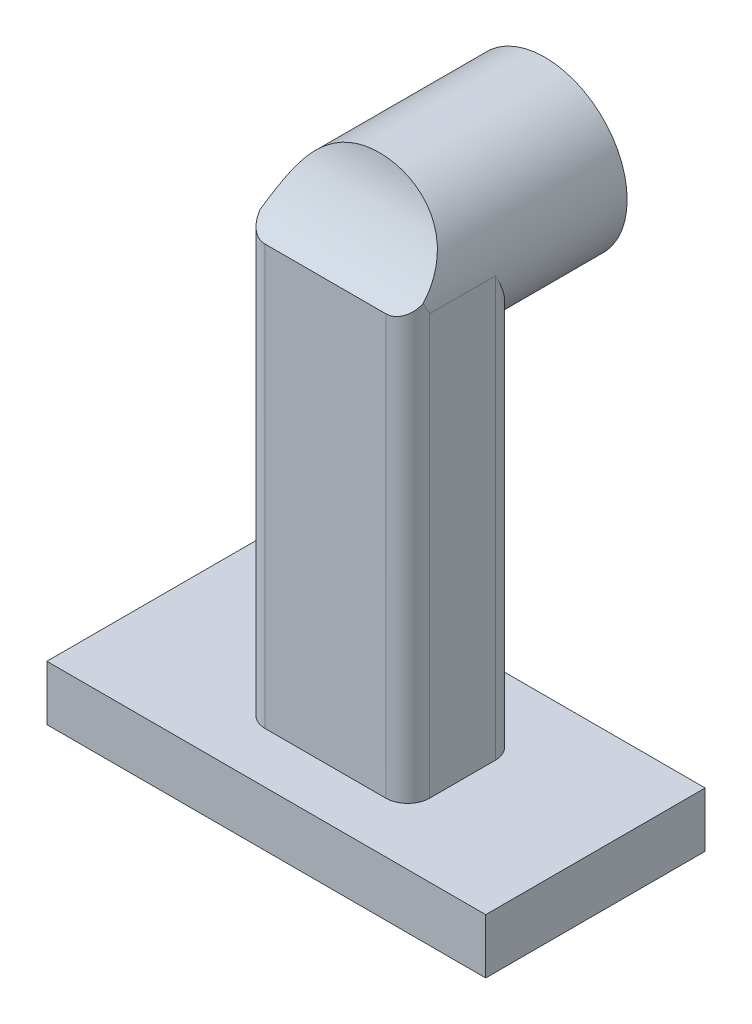
ISO-10303-21;
HEADER;
FILE_DESCRIPTION(('STEP AP214'),'2;1');
FILE_NAME('part.step','',(''),(''),'','','');
FILE_SCHEMA(('AUTOMOTIVE_DESIGN { 1 0 10303 214 1 1 1 1 }'));
ENDSEC;
DATA;
#1=APPLICATION_CONTEXT('core data for automotive mechanical design processes');
#2=APPLICATION_PROTOCOL_DEFINITION('international standard','automotive_design',2000,#1);
#3=PRODUCT_CONTEXT('',#1,'mechanical');
#4=PRODUCT('Part','Part','',(#3));
#5=PRODUCT_RELATED_PRODUCT_CATEGORY('part','',(#4));
#6=PRODUCT_DEFINITION_FORMATION('','',#4);
#7=PRODUCT_DEFINITION_CONTEXT('part definition',#1,'design');
#8=PRODUCT_DEFINITION('design','',#6,#7);
#9=PRODUCT_DEFINITION_SHAPE('','',#8);
#10=(LENGTH_UNIT() NAMED_UNIT(*) SI_UNIT(.MILLI.,.METRE.));
#11=(NAMED_UNIT(*) PLANE_ANGLE_UNIT() SI_UNIT($,.RADIAN.));
#12=(NAMED_UNIT(*) SI_UNIT($,.STERADIAN.) SOLID_ANGLE_UNIT());
#13=UNCERTAINTY_MEASURE_WITH_UNIT(LENGTH_MEASURE(1.E-05),#10,'distance_accuracy_value','');
#14=(GEOMETRIC_REPRESENTATION_CONTEXT(3) GLOBAL_UNCERTAINTY_ASSIGNED_CONTEXT((#13)) GLOBAL_UNIT_ASSIGNED_CONTEXT((#10,
#11,#12)) REPRESENTATION_CONTEXT('',''));
#15=CARTESIAN_POINT('',(0.,0.,0.));
#16=DIRECTION('',(0.,0.,1.));
#17=DIRECTION('',(1.,0.,0.));
#18=AXIS2_PLACEMENT_3D('',#15,#16,#17);
#19=CARTESIAN_POINT('',(0.,31.7142857142858,15.));
#20=DIRECTION('',(0.,0.,-1.));
#21=DIRECTION('',(-1.,0.,0.));
#22=AXIS2_PLACEMENT_3D('',#19,#20,#21);
#23=CYLINDRICAL_SURFACE('',#22,7.5);
#24=DIRECTION('',(0.,0.,1.));
#25=VECTOR('',#24,1.);
#26=CARTESIAN_POINT('',(-7.5,31.7142857142858,10.));
#27=LINE('',#26,#25);
#28=CARTESIAN_POINT('',(-7.5,31.7142857142858,12.));
#29=VERTEX_POINT('',#28);
#30=CARTESIAN_POINT('',(-7.5,31.7142857142858,18.));
#31=VERTEX_POINT('',#30);
#32=EDGE_CURVE('E178',#29,#31,#27,.T.);
#33=ORIENTED_EDGE('',*,*,#32,.T.);
#34=CARTESIAN_POINT('',(-7.42828389927455,32.7489829220614,18.530774155172));
#35=CARTESIAN_POINT('',(-7.45190089264952,32.5793512710142,18.4449269340188));
#36=CARTESIAN_POINT('',(-7.46966271610241,32.4093934973662,18.358046270152));
#37=CARTESIAN_POINT('',(-7.49351926490928,32.0695040462761,18.1834226286113));
#38=CARTESIAN_POINT('',(-7.49963574905937,31.89957291454,18.0956815676288));
#39=CARTESIAN_POINT('',(-7.49999473202665,31.724545468634,18.0052981125601));
#40=CARTESIAN_POINT('',(-7.49999999489412,31.7194155736733,18.0026490461109));
#41=CARTESIAN_POINT('',(-7.5,31.7142857142858,18.));
#42=B_SPLINE_CURVE_WITH_KNOTS('',3,(#34,#35,#36,#37,#38,#39,#40,#41),.UNSPECIFIED.,.F.,.F.,(4,2,
2,4),(0.,0.574711385582151,1.14834789074926,1.16566840602221),.UNSPECIFIED.);
#43=CARTESIAN_POINT('',(-7.42828389927455,32.7489829220614,18.530774155172));
#44=VERTEX_POINT('',#43);
#45=EDGE_CURVE('E224',#31,#44,#42,.F.);
#46=ORIENTED_EDGE('',*,*,#45,.T.);
#47=CARTESIAN_POINT('',(-7.5,31.7142857142858,20.));
#48=CARTESIAN_POINT('',(-7.49997947022665,31.8300297324728,19.799463736408));
#49=CARTESIAN_POINT('',(-7.49731929158803,31.9528236813804,19.6029216316628));
#50=CARTESIAN_POINT('',(-7.48461263215864,32.2117613698325,19.2187715451666));
#51=CARTESIAN_POINT('',(-7.47455767069132,32.3479202814414,19.031174084799));
#52=CARTESIAN_POINT('',(-7.44486452192456,32.6333396918552,18.6653357941587));
#53=CARTESIAN_POINT('',(-7.42517465671868,32.7826672409156,18.4871512264745));
#54=CARTESIAN_POINT('',(-7.37396931885938,33.0923991582677,18.142593196295));
#55=CARTESIAN_POINT('',(-7.34245976664357,33.2527979482482,17.9762138701306));
#56=CARTESIAN_POINT('',(-7.27156816511602,33.5567368043505,17.6818750036999));
#57=CARTESIAN_POINT('',(-7.23423036948041,33.698910121249,17.5520096676919));
#58=CARTESIAN_POINT('',(-7.14846464553897,33.9885442732456,17.3022335173043));
#59=CARTESIAN_POINT('',(-7.1000387962348,34.1360041127588,17.1823208425437));
#60=CARTESIAN_POINT('',(-6.99122197651252,34.4341983888275,16.9534125414698));
#61=CARTESIAN_POINT('',(-6.93086682452595,34.5849218482469,16.8443856701614));
#62=CARTESIAN_POINT('',(-6.79731370783965,34.8882388363534,16.637331889674));
#63=CARTESIAN_POINT('',(-6.72411595473926,35.0408323341906,16.5393047993024));
#64=CARTESIAN_POINT('',(-6.56397643536317,35.3466615217733,16.3540431697069));
#65=CARTESIAN_POINT('',(-6.47696597584459,35.4998964821475,16.266866678474));
#66=CARTESIAN_POINT('',(-6.28932187434638,35.8040730015986,16.1038991718804));
#67=CARTESIAN_POINT('',(-6.18868800528389,35.9550145224006,16.0281083463471));
#68=CARTESIAN_POINT('',(-5.97391094832465,36.2525765961502,15.8875620783022));
#69=CARTESIAN_POINT('',(-5.85975638935033,36.3991933806492,15.8228160378698));
#70=CARTESIAN_POINT('',(-5.61853413824167,36.6859222830463,15.703861081419));
#71=CARTESIAN_POINT('',(-5.49146692780388,36.8260346433029,15.6496517725556));
#72=CARTESIAN_POINT('',(-5.23452245496772,37.0883999673142,15.5543984099222));
#73=CARTESIAN_POINT('',(-5.10546140165159,37.2112168016263,15.5126992615376));
#74=CARTESIAN_POINT('',(-4.83765037908191,37.4483175471951,15.4369086217491));
#75=CARTESIAN_POINT('',(-4.6989009008013,37.5626018902399,15.4028167452042));
#76=CARTESIAN_POINT('',(-4.41256553042484,37.7815551083798,15.3413578320313));
#77=CARTESIAN_POINT('',(-4.26497771460997,37.886221877494,15.3139922660912));
#78=CARTESIAN_POINT('',(-3.96193609881429,38.0849923789193,15.2650910800854));
#79=CARTESIAN_POINT('',(-3.80648202088287,38.1790957375986,15.2435556661962));
#80=CARTESIAN_POINT('',(-3.48063432880283,38.3604642081219,15.2044631904618));
#81=CARTESIAN_POINT('',(-3.30988281939107,38.4471418150068,15.187162779071));
#82=CARTESIAN_POINT('',(-2.96191709415959,38.6073066805713,15.1570568569415));
#83=CARTESIAN_POINT('',(-2.78470249654392,38.680793158484,15.1442516122236));
#84=CARTESIAN_POINT('',(-2.42510319643625,38.8139762165239,15.1222878301859));
#85=CARTESIAN_POINT('',(-2.24272262146909,38.8736834754834,15.1131264648651));
#86=CARTESIAN_POINT('',(-1.87386192936245,38.9789557438518,15.097719089321));
#87=CARTESIAN_POINT('',(-1.68738267985585,39.0245237160582,15.0914724681932));
#88=CARTESIAN_POINT('',(-1.25295397163505,39.1131592107462,15.0797410124886));
#89=CARTESIAN_POINT('',(-1.00390855808538,39.1510503055967,15.0750959783665));
#90=CARTESIAN_POINT('',(-0.50323218156738,39.2016132826796,15.0689932956617));
#91=CARTESIAN_POINT('',(-0.251601134470506,39.2142843417013,15.0675357511222));
#92=CARTESIAN_POINT('',(0.20665092681727,39.214286841649,15.0675390048493));
#93=CARTESIAN_POINT('',(0.413281674428667,39.2057409358025,15.0685249440406));
#94=CARTESIAN_POINT('',(0.825179286914942,39.1716168798197,15.0725995530894));
#95=CARTESIAN_POINT('',(1.03044576522508,39.1460340940707,15.0756887952457));
#96=CARTESIAN_POINT('',(1.43837174912811,39.0779737983363,15.0843511909973));
#97=CARTESIAN_POINT('',(1.64102762473084,39.0354749375616,15.0899274847249));
#98=CARTESIAN_POINT('',(2.04202119975711,38.9339063500573,15.1041825371708));
#99=CARTESIAN_POINT('',(2.24035919214448,38.8748377513666,15.1128610847041));
#100=CARTESIAN_POINT('',(2.63147873882464,38.7405301869507,15.134168206578));
#101=CARTESIAN_POINT('',(2.82425488916164,38.6652760579644,15.1468004900256));
#102=CARTESIAN_POINT('',(3.20261935265094,38.4992622777185,15.177044788796));
#103=CARTESIAN_POINT('',(3.38820750085756,38.4085022708981,15.1946569183163));
#104=CARTESIAN_POINT('',(3.75066396371892,38.212359111719,15.2360350926952));
#105=CARTESIAN_POINT('',(3.92753645458062,38.1069830569881,15.2597981554513));
#106=CARTESIAN_POINT('',(4.27123126739658,37.8826475562933,15.3147637218743));
#107=CARTESIAN_POINT('',(4.43805404674669,37.7636887292412,15.3459658866419));
#108=CARTESIAN_POINT('',(4.75540880578962,37.5173203715082,15.4160450807998));
#109=CARTESIAN_POINT('',(4.90628078424046,37.3902749644493,15.4546616166388));
#110=CARTESIAN_POINT('',(5.1961273407495,37.1261885124987,15.5412730956522));
#111=CARTESIAN_POINT('',(5.33510218752381,36.9891476934991,15.5892678269246));
#112=CARTESIAN_POINT('',(5.60006908907717,36.70694676478,15.6956205794986));
#113=CARTESIAN_POINT('',(5.72606905660451,36.5617916878983,15.7539722247655));
#114=CARTESIAN_POINT('',(5.9644079229706,36.2653300539792,15.8818619836834));
#115=CARTESIAN_POINT('',(6.07674776889822,36.1140239243806,15.951399321026));
#116=CARTESIAN_POINT('',(6.27942607903662,35.8189675000772,16.0965324462162));
#117=CARTESIAN_POINT('',(6.37078200965697,35.6754994913075,16.1712850172543));
#118=CARTESIAN_POINT('',(6.54133249068087,35.3870289145572,16.3309800487646));
#119=CARTESIAN_POINT('',(6.62052770940052,35.2420264313751,16.4159219488046));
#120=CARTESIAN_POINT('',(6.76694922788573,34.9523015145867,16.595928665728));
#121=CARTESIAN_POINT('',(6.83417683501177,34.807579052101,16.6909923750738));
#122=CARTESIAN_POINT('',(6.95714605734311,34.5200950947532,16.8909840026296));
#123=CARTESIAN_POINT('',(7.01288744385311,34.3773336389884,16.9959121171834));
#124=CARTESIAN_POINT('',(7.1137881303945,34.0947522002077,17.2156292164316));
#125=CARTESIAN_POINT('',(7.15890470810607,33.9549460831521,17.3304555581534));
#126=CARTESIAN_POINT('',(7.23917471989298,33.6802045716417,17.5690520614072));
#127=CARTESIAN_POINT('',(7.27432777219934,33.5452693639967,17.6928225654216));
#128=CARTESIAN_POINT('',(7.33572642516498,33.281289169851,17.9487858169241));
#129=CARTESIAN_POINT('',(7.36196456788971,33.1522491928342,18.0809855067521));
#130=CARTESIAN_POINT('',(7.40660469378779,32.9010816473765,18.3530655320413));
#131=CARTESIAN_POINT('',(7.425004820841,32.7789557221823,18.4929476779407));
#132=CARTESIAN_POINT('',(7.46246035599878,32.4844958116708,18.8498990624335));
#133=CARTESIAN_POINT('',(7.47743876178564,32.3168032891735,19.0712723565462));
#134=CARTESIAN_POINT('',(7.49150705474002,32.0797459598552,19.4129104775812));
#135=CARTESIAN_POINT('',(7.49479812937745,32.003260923985,19.5281775022434));
#136=CARTESIAN_POINT('',(7.49904270891795,31.8551208326223,19.7618117788647));
#137=CARTESIAN_POINT('',(7.49999630305651,31.7834655928494,19.8801789122998));
#138=CARTESIAN_POINT('',(7.5,31.7142857142858,20.));
#139=B_SPLINE_CURVE_WITH_KNOTS('',3,(#47,#48,#49,#50,#51,#52,#53,#54,#55,#56,#57,#58,#59,#60,
#61,#62,#63,#64,#65,#66,#67,#68,#69,#70,#71,#72,#73,#74,#75,#76,#77,#78,#79,#80,#81,#82,#83,#84,
#85,#86,#87,#88,#89,#90,#91,#92,#93,#94,#95,#96,#97,#98,#99,#100,#101,#102,#103,#104,#105,#106,
#107,#108,#109,#110,#111,#112,#113,#114,#115,#116,#117,#118,#119,#120,#121,#122,#123,#124,#125,
#126,#127,#128,#129,#130,#131,#132,#133,#134,#135,#136,#137,#138),.UNSPECIFIED.,.F.,.F.,(4,2,2,
2,2,2,2,2,2,2,2,2,2,2,2,2,2,2,2,2,2,2,2,2,2,2,2,2,2,2,2,2,2,2,2,2,2,2,2,2,2,2,2,2,2,4),(0.,
0.694570167890533,1.38993814537298,2.08907738071809,2.78786688641169,3.37570773489505,
3.96343845379065,4.54943057462419,5.13541304134706,5.72440668533054,6.31341014820949,
6.90291253588654,7.49239294069636,8.04069919501781,8.58897768337745,9.13737594477243,
9.68579359710709,10.2619796544099,10.8381998042333,11.4139718750697,11.9896232149333,
12.7441416974492,13.4986848079011,14.118423798453,14.7383314844778,15.3590240867678,
15.979674443638,16.6009088035043,17.2221574106248,17.8431053856024,18.4640250777839,
19.0661764324764,19.6683141830088,20.2700825167167,20.8718091045698,21.4284907103058,
21.985141711539,22.5417318659863,23.0983331012988,23.657135606618,24.2159595204866,
24.7752497844986,25.3346724204842,26.1675745746305,26.5825847885888,26.997579158897),.UNSPECIFIED.);
#140=CARTESIAN_POINT('',(7.42828389927427,32.7489829220633,18.5307741551697));
#141=VERTEX_POINT('',#140);
#142=EDGE_CURVE('E193',#44,#141,#139,.T.);
#143=ORIENTED_EDGE('',*,*,#142,.T.);
#144=CARTESIAN_POINT('',(7.42828389927427,32.7489829220633,18.5307741551697));
#145=CARTESIAN_POINT('',(7.45190089264941,32.579351271015,18.4449269340185));
#146=CARTESIAN_POINT('',(7.46966271610237,32.4093934973666,18.3580462701521));
#147=CARTESIAN_POINT('',(7.49351926490928,32.0695040462763,18.1834226286115));
#148=CARTESIAN_POINT('',(7.49963574905935,31.8995729145403,18.0956815676285));
#149=CARTESIAN_POINT('',(7.49999473202665,31.724545468634,18.0052981125601));
#150=CARTESIAN_POINT('',(7.49999999489412,31.7194155736733,18.0026490461109));
#151=CARTESIAN_POINT('',(7.5,31.7142857142858,18.));
#152=B_SPLINE_CURVE_WITH_KNOTS('',3,(#144,#145,#146,#147,#148,#149,#150,#151),.UNSPECIFIED.,.F.,
.F.,(4,2,2,4),(0.,0.574711385582514,1.14834789074999,1.16566840602293),.UNSPECIFIED.);
#153=CARTESIAN_POINT('',(7.5,31.7142857142858,18.));
#154=VERTEX_POINT('',#153);
#155=EDGE_CURVE('E53',#141,#154,#152,.T.);
#156=ORIENTED_EDGE('',*,*,#155,.T.);
#157=DIRECTION('',(0.,0.,1.));
#158=VECTOR('',#157,1.);
#159=CARTESIAN_POINT('',(7.5,31.7142857142858,10.));
#160=LINE('',#159,#158);
#161=CARTESIAN_POINT('',(7.5,31.7142857142858,12.));
#162=VERTEX_POINT('',#161);
#163=EDGE_CURVE('E182',#162,#154,#160,.T.);
#164=ORIENTED_EDGE('',*,*,#163,.F.);
#165=CARTESIAN_POINT('',(5.5,26.615266200693,10.));
#166=CARTESIAN_POINT('',(5.5838735625346,26.7057073597006,10.0000376984018));
#167=CARTESIAN_POINT('',(5.66540543927748,26.7981531377399,10.0052713271063));
#168=CARTESIAN_POINT('',(5.82325324536424,26.9862116367144,10.0246893030014));
#169=CARTESIAN_POINT('',(5.89957888470958,27.0818179392423,10.0388564529449));
#170=CARTESIAN_POINT('',(6.04618182718063,27.2748847955983,10.074559287519));
#171=CARTESIAN_POINT('',(6.11650495776172,27.3723227311482,10.0960314263168));
#172=CARTESIAN_POINT('',(6.25174389528762,27.5694106340509,10.1452593425902));
#173=CARTESIAN_POINT('',(6.31665611761133,27.6690620132765,10.1730192410298));
#174=CARTESIAN_POINT('',(6.47418036997727,27.9237915083804,10.2500723707414));
#175=CARTESIAN_POINT('',(6.56309720992839,28.0800797586921,10.3029530221486));
#176=CARTESIAN_POINT('',(6.72823007903668,28.3957498426527,10.4183552788745));
#177=CARTESIAN_POINT('',(6.80444189774752,28.5551326823897,10.4808800670981));
#178=CARTESIAN_POINT('',(6.9448606559125,28.8770498232048,10.6137222482944));
#179=CARTESIAN_POINT('',(7.00900155909153,29.0395963806555,10.6840793357416));
#180=CARTESIAN_POINT('',(7.1251258354692,29.3663818139644,10.8305141632412));
#181=CARTESIAN_POINT('',(7.1771108062949,29.530620464469,10.9065911498011));
#182=CARTESIAN_POINT('',(7.26946547693176,29.86106674954,11.0633566213054));
#183=CARTESIAN_POINT('',(7.30978477168666,30.0272797905243,11.1440633642412));
#184=CARTESIAN_POINT('',(7.37879092805543,30.3606101473289,11.3085487363188));
#185=CARTESIAN_POINT('',(7.40747355029198,30.5277277702713,11.3923284728897));
#186=CARTESIAN_POINT('',(7.47621611769091,31.0289634381359,11.6461301959614));
#187=CARTESIAN_POINT('',(7.49929759585052,31.3641496049488,11.8191909256303));
#188=CARTESIAN_POINT('',(7.49999473288974,31.70402603317,11.9947019284023));
#189=CARTESIAN_POINT('',(7.49999999569959,31.7091559287259,11.9973509952173));
#190=CARTESIAN_POINT('',(7.5,31.7142857142858,12.));
#191=B_SPLINE_CURVE_WITH_KNOTS('',3,(#165,#166,#167,#168,#169,#170,#171,#172,#173,#174,#175,
#176,#177,#178,#179,#180,#181,#182,#183,#184,#185,#186,#187,#188,#189,#190),.UNSPECIFIED.,.F.,
.F.,(4,2,2,2,2,2,2,2,2,2,2,2,4),(0.,0.369717687843046,0.738725823760761,1.10460273899726,
1.47072014543853,2.03213982203334,2.59374518493209,3.15833887293874,3.72285831589875,
4.28978170341005,4.85691144274635,5.98712235199295,6.00444286726743),.UNSPECIFIED.);
#192=CARTESIAN_POINT('',(5.5,26.615266200693,10.));
#193=VERTEX_POINT('',#192);
#194=EDGE_CURVE('E11',#162,#193,#191,.F.);
#195=ORIENTED_EDGE('',*,*,#194,.T.);
#196=CARTESIAN_POINT('',(0.,31.7142857142858,10.));
#197=DIRECTION('',(0.,0.,-1.));
#198=DIRECTION('',(-1.,0.,0.));
#199=AXIS2_PLACEMENT_3D('',#196,#197,#198);
#200=CIRCLE('',#199,7.5);
#201=CARTESIAN_POINT('',(-5.5,26.615266200693,10.));
#202=VERTEX_POINT('',#201);
#203=EDGE_CURVE('E190',#193,#202,#200,.T.);
#204=ORIENTED_EDGE('',*,*,#203,.T.);
#205=CARTESIAN_POINT('',(-5.5,26.615266200693,10.));
#206=CARTESIAN_POINT('',(-5.5838735625346,26.7057073597006,10.0000376984018));
#207=CARTESIAN_POINT('',(-5.66540543927748,26.7981531377399,10.0052713271063));
#208=CARTESIAN_POINT('',(-5.82325324536424,26.9862116367144,10.0246893030014));
#209=CARTESIAN_POINT('',(-5.89957888470958,27.0818179392423,10.0388564529449));
#210=CARTESIAN_POINT('',(-6.04618182718063,27.2748847955983,10.074559287519));
#211=CARTESIAN_POINT('',(-6.11650495776172,27.3723227311482,10.0960314263168));
#212=CARTESIAN_POINT('',(-6.25174389528762,27.5694106340509,10.1452593425902));
#213=CARTESIAN_POINT('',(-6.31665611761133,27.6690620132765,10.1730192410298));
#214=CARTESIAN_POINT('',(-6.47418036997727,27.9237915083804,10.2500723707414));
#215=CARTESIAN_POINT('',(-6.56309720992839,28.0800797586921,10.3029530221486));
#216=CARTESIAN_POINT('',(-6.72823007903668,28.3957498426527,10.4183552788745));
#217=CARTESIAN_POINT('',(-6.80444189774752,28.5551326823897,10.4808800670981));
#218=CARTESIAN_POINT('',(-6.9448606559125,28.8770498232048,10.6137222482944));
#219=CARTESIAN_POINT('',(-7.00900155909153,29.0395963806555,10.6840793357416));
#220=CARTESIAN_POINT('',(-7.1251258354692,29.3663818139644,10.8305141632412));
#221=CARTESIAN_POINT('',(-7.1771108062949,29.530620464469,10.9065911498011));
#222=CARTESIAN_POINT('',(-7.26946547693176,29.86106674954,11.0633566213054));
#223=CARTESIAN_POINT('',(-7.30978477168666,30.0272797905243,11.1440633642412));
#224=CARTESIAN_POINT('',(-7.37879092805543,30.3606101473289,11.3085487363188));
#225=CARTESIAN_POINT('',(-7.40747355029198,30.5277277702713,11.3923284728897));
#226=CARTESIAN_POINT('',(-7.47621611769091,31.0289634381359,11.6461301959614));
#227=CARTESIAN_POINT('',(-7.49929759585052,31.3641496049488,11.8191909256303));
#228=CARTESIAN_POINT('',(-7.49999473288974,31.70402603317,11.9947019284023));
#229=CARTESIAN_POINT('',(-7.49999999569959,31.7091559287259,11.9973509952173));
#230=CARTESIAN_POINT('',(-7.5,31.7142857142858,12.));
#231=B_SPLINE_CURVE_WITH_KNOTS('',3,(#205,#206,#207,#208,#209,#210,#211,#212,#213,#214,#215,
#216,#217,#218,#219,#220,#221,#222,#223,#224,#225,#226,#227,#228,#229,#230),.UNSPECIFIED.,.F.,
.F.,(4,2,2,2,2,2,2,2,2,2,2,2,4),(0.,0.369717687843046,0.738725823760761,1.10460273899726,
1.47072014543853,2.03213982203334,2.59374518493209,3.15833887293874,3.72285831589875,
4.28978170341005,4.85691144274635,5.98712235199295,6.00444286726743),.UNSPECIFIED.);
#232=EDGE_CURVE('E46',#202,#29,#231,.T.);
#233=ORIENTED_EDGE('',*,*,#232,.T.);
#234=EDGE_LOOP('',(#33,#46,#143,#156,#164,#195,#204,#233));
#235=FACE_BOUND('',#234,.T.);
#236=CARTESIAN_POINT('',(0.,31.7142857142858,0.));
#237=DIRECTION('',(0.,0.,1.));
#238=DIRECTION('',(1.,0.,0.));
#239=AXIS2_PLACEMENT_3D('',#236,#237,#238);
#240=CIRCLE('',#239,7.5);
#241=CARTESIAN_POINT('',(7.5,31.7142857142858,0.));
#242=VERTEX_POINT('',#241);
#243=EDGE_CURVE('E181',#242,#242,#240,.T.);
#244=ORIENTED_EDGE('',*,*,#243,.T.);
#245=EDGE_LOOP('',(#244));
#246=FACE_BOUND('',#245,.T.);
#247=ADVANCED_FACE('F32',(#235,#246),#23,.T.);
#248=CARTESIAN_POINT('',(0.,31.7142857142858,0.));
#249=DIRECTION('',(0.,0.,1.));
#250=DIRECTION('',(1.,0.,0.));
#251=AXIS2_PLACEMENT_3D('',#248,#249,#250);
#252=PLANE('',#251);
#253=CARTESIAN_POINT('',(0.,31.7142857142858,0.));
#254=DIRECTION('',(0.,0.,-1.));
#255=DIRECTION('',(-1.,0.,0.));
#256=AXIS2_PLACEMENT_3D('',#253,#254,#255);
#257=CIRCLE('',#256,3.5);
#258=CARTESIAN_POINT('',(-3.5,31.7142857142858,0.));
#259=VERTEX_POINT('',#258);
#260=EDGE_CURVE('E158',#259,#259,#257,.T.);
#261=ORIENTED_EDGE('',*,*,#260,.F.);
#262=EDGE_LOOP('',(#261));
#263=FACE_BOUND('',#262,.T.);
#264=ORIENTED_EDGE('',*,*,#243,.F.);
#265=EDGE_LOOP('',(#264));
#266=FACE_BOUND('',#265,.T.);
#267=ADVANCED_FACE('F316',(#263,#266),#252,.F.);
#268=CARTESIAN_POINT('',(-7.5,-6.5223606883933,10.));
#269=DIRECTION('',(-1.,0.,0.));
#270=DIRECTION('',(0.,-1.,0.));
#271=AXIS2_PLACEMENT_3D('',#268,#269,#270);
#272=PLANE('',#271);
#273=ORIENTED_EDGE('',*,*,#32,.F.);
#274=DIRECTION('',(0.,-1.,0.));
#275=VECTOR('',#274,1.);
#276=CARTESIAN_POINT('',(-7.5,-6.5223606883933,12.));
#277=LINE('',#276,#275);
#278=CARTESIAN_POINT('',(-7.5,-6.5223606883933,12.));
#279=VERTEX_POINT('',#278);
#280=EDGE_CURVE('E268',#29,#279,#277,.T.);
#281=ORIENTED_EDGE('',*,*,#280,.T.);
#282=DIRECTION('',(0.,0.,1.));
#283=VECTOR('',#282,1.);
#284=CARTESIAN_POINT('',(-7.5,-6.5223606883933,10.));
#285=LINE('',#284,#283);
#286=CARTESIAN_POINT('',(-7.5,-6.5223606883933,18.));
#287=VERTEX_POINT('',#286);
#288=EDGE_CURVE('E177',#279,#287,#285,.T.);
#289=ORIENTED_EDGE('',*,*,#288,.T.);
#290=DIRECTION('',(0.,-1.,0.));
#291=VECTOR('',#290,1.);
#292=CARTESIAN_POINT('',(-7.5,31.7142857142858,18.));
#293=LINE('',#292,#291);
#294=EDGE_CURVE('E200',#287,#31,#293,.F.);
#295=ORIENTED_EDGE('',*,*,#294,.T.);
#296=EDGE_LOOP('',(#273,#281,#289,#295));
#297=FACE_BOUND('',#296,.T.);
#298=ADVANCED_FACE('F275',(#297),#272,.T.);
#299=CARTESIAN_POINT('',(7.5,31.7142857142858,10.));
#300=DIRECTION('',(1.,0.,0.));
#301=DIRECTION('',(0.,1.,0.));
#302=AXIS2_PLACEMENT_3D('',#299,#300,#301);
#303=PLANE('',#302);
#304=ORIENTED_EDGE('',*,*,#163,.T.);
#305=DIRECTION('',(0.,1.,0.));
#306=VECTOR('',#305,1.);
#307=CARTESIAN_POINT('',(7.5,-6.5223606883933,18.));
#308=LINE('',#307,#306);
#309=CARTESIAN_POINT('',(7.5,-6.5223606883933,18.));
#310=VERTEX_POINT('',#309);
#311=EDGE_CURVE('E285',#154,#310,#308,.F.);
#312=ORIENTED_EDGE('',*,*,#311,.T.);
#313=DIRECTION('',(0.,0.,1.));
#314=VECTOR('',#313,1.);
#315=CARTESIAN_POINT('',(7.5,-6.5223606883933,10.));
#316=LINE('',#315,#314);
#317=CARTESIAN_POINT('',(7.5,-6.5223606883933,12.));
#318=VERTEX_POINT('',#317);
#319=EDGE_CURVE('E184',#318,#310,#316,.T.);
#320=ORIENTED_EDGE('',*,*,#319,.F.);
#321=DIRECTION('',(0.,1.,0.));
#322=VECTOR('',#321,1.);
#323=CARTESIAN_POINT('',(7.5,31.7142857142858,12.));
#324=LINE('',#323,#322);
#325=EDGE_CURVE('E284',#318,#162,#324,.T.);
#326=ORIENTED_EDGE('',*,*,#325,.T.);
#327=EDGE_LOOP('',(#304,#312,#320,#326));
#328=FACE_BOUND('',#327,.T.);
#329=ADVANCED_FACE('F295',(#328),#303,.T.);
#330=CARTESIAN_POINT('',(0.,0.,10.));
#331=DIRECTION('',(0.,0.,-1.));
#332=DIRECTION('',(-1.,0.,0.));
#333=AXIS2_PLACEMENT_3D('',#330,#331,#332);
#334=PLANE('',#333);
#335=DIRECTION('',(1.,0.,0.));
#336=VECTOR('',#335,1.);
#337=CARTESIAN_POINT('',(7.5,-6.5223606883933,10.));
#338=LINE('',#337,#336);
#339=CARTESIAN_POINT('',(-5.5,-6.5223606883933,10.));
#340=VERTEX_POINT('',#339);
#341=CARTESIAN_POINT('',(5.5,-6.5223606883933,10.));
#342=VERTEX_POINT('',#341);
#343=EDGE_CURVE('E174',#340,#342,#338,.T.);
#344=ORIENTED_EDGE('',*,*,#343,.F.);
#345=DIRECTION('',(0.,-1.,0.));
#346=VECTOR('',#345,1.);
#347=CARTESIAN_POINT('',(-5.5,0.,10.));
#348=LINE('',#347,#346);
#349=EDGE_CURVE('E253',#340,#202,#348,.F.);
#350=ORIENTED_EDGE('',*,*,#349,.T.);
#351=ORIENTED_EDGE('',*,*,#203,.F.);
#352=DIRECTION('',(0.,1.,0.));
#353=VECTOR('',#352,1.);
#354=CARTESIAN_POINT('',(5.5,0.,10.));
#355=LINE('',#354,#353);
#356=EDGE_CURVE('E255',#193,#342,#355,.F.);
#357=ORIENTED_EDGE('',*,*,#356,.T.);
#358=EDGE_LOOP('',(#344,#350,#351,#357));
#359=FACE_BOUND('',#358,.T.);
#360=ADVANCED_FACE('F304',(#359),#334,.T.);
#361=CARTESIAN_POINT('',(0.,0.,20.));
#362=DIRECTION('',(0.,0.,-1.));
#363=DIRECTION('',(-1.,0.,0.));
#364=AXIS2_PLACEMENT_3D('',#361,#362,#363);
#365=PLANE('',#364);
#366=DIRECTION('',(-1.,0.,0.));
#367=VECTOR('',#366,1.);
#368=CARTESIAN_POINT('',(-7.5,31.7142857142858,20.));
#369=LINE('',#368,#367);
#370=CARTESIAN_POINT('',(5.5,31.7142857142858,20.));
#371=VERTEX_POINT('',#370);
#372=CARTESIAN_POINT('',(-5.5,31.7142857142858,20.));
#373=VERTEX_POINT('',#372);
#374=EDGE_CURVE('E171',#371,#373,#369,.T.);
#375=ORIENTED_EDGE('',*,*,#374,.T.);
#376=DIRECTION('',(0.,-1.,0.));
#377=VECTOR('',#376,1.);
#378=CARTESIAN_POINT('',(-5.5,-6.5223606883933,20.));
#379=LINE('',#378,#377);
#380=CARTESIAN_POINT('',(-5.5,-6.5223606883933,20.));
#381=VERTEX_POINT('',#380);
#382=EDGE_CURVE('E247',#373,#381,#379,.T.);
#383=ORIENTED_EDGE('',*,*,#382,.T.);
#384=DIRECTION('',(1.,0.,0.));
#385=VECTOR('',#384,1.);
#386=CARTESIAN_POINT('',(7.5,-6.5223606883933,20.));
#387=LINE('',#386,#385);
#388=CARTESIAN_POINT('',(5.5,-6.5223606883933,20.));
#389=VERTEX_POINT('',#388);
#390=EDGE_CURVE('E168',#381,#389,#387,.T.);
#391=ORIENTED_EDGE('',*,*,#390,.T.);
#392=DIRECTION('',(0.,1.,0.));
#393=VECTOR('',#392,1.);
#394=CARTESIAN_POINT('',(5.5,31.7142857142858,20.));
#395=LINE('',#394,#393);
#396=EDGE_CURVE('E250',#389,#371,#395,.T.);
#397=ORIENTED_EDGE('',*,*,#396,.T.);
#398=EDGE_LOOP('',(#375,#383,#391,#397));
#399=FACE_BOUND('',#398,.T.);
#400=ADVANCED_FACE('F209',(#399),#365,.F.);
#401=CARTESIAN_POINT('',(-7.5,40.3745397521302,25.));
#402=DIRECTION('',(-1.,0.,0.));
#403=DIRECTION('',(0.,0.,1.));
#404=AXIS2_PLACEMENT_3D('',#401,#402,#403);
#405=CYLINDRICAL_SURFACE('',#404,10.);
#406=ORIENTED_EDGE('',*,*,#142,.F.);
#407=CARTESIAN_POINT('',(-7.42828389927455,32.7489829220614,18.530774155172));
#408=CARTESIAN_POINT('',(-7.41082409926327,32.6951451087617,18.5942128098737));
#409=CARTESIAN_POINT('',(-7.38993908577392,32.6425494596835,18.6578367153484));
#410=CARTESIAN_POINT('',(-7.34085649509703,32.5401460456077,18.7847874101483));
#411=CARTESIAN_POINT('',(-7.3126402787528,32.4903457859903,18.8481130170573));
#412=CARTESIAN_POINT('',(-7.24834069479883,32.3938506187382,18.9738130547531));
#413=CARTESIAN_POINT('',(-7.21221452836898,32.3471744823271,19.0361802547735));
#414=CARTESIAN_POINT('',(-7.13198638048463,32.2577789739133,19.1584313928174));
#415=CARTESIAN_POINT('',(-7.08789434552802,32.2150547668444,19.2183183144612));
#416=CARTESIAN_POINT('',(-6.97593406547953,32.120796617608,19.3533633927392));
#417=CARTESIAN_POINT('',(-6.90499350454702,32.0709034193921,19.4271701674236));
#418=CARTESIAN_POINT('',(-6.74962688084254,31.9800520755622,19.5649846990302));
#419=CARTESIAN_POINT('',(-6.665243720594,31.9390664533291,19.6290224023962));
#420=CARTESIAN_POINT('',(-6.48375877841246,31.8665319942433,19.7446682607171));
#421=CARTESIAN_POINT('',(-6.38657630347904,31.8350475917881,19.7961911038438));
#422=CARTESIAN_POINT('',(-6.18254572280996,31.7826322095316,19.8831914622765));
#423=CARTESIAN_POINT('',(-6.07569791379816,31.7617009058817,19.9186694699552));
#424=CARTESIAN_POINT('',(-5.89015794501395,31.7356538792865,19.9631254870507));
#425=CARTESIAN_POINT('',(-5.81298138107614,31.7276486415695,19.976906175296));
#426=CARTESIAN_POINT('',(-5.65722227810773,31.7169638250829,19.9953612485741));
#427=CARTESIAN_POINT('',(-5.57864037574043,31.7142818934135,20.0000396567939));
#428=CARTESIAN_POINT('',(-5.5,31.7142857142858,20.));
#429=B_SPLINE_CURVE_WITH_KNOTS('',3,(#407,#408,#409,#410,#411,#412,#413,#414,#415,#416,#417,
#418,#419,#420,#421,#422,#423,#424,#425,#426,#427,#428),.UNSPECIFIED.,.F.,.F.,(4,2,2,2,2,2,2,2,
2,2,4),(0.,0.255054001543536,0.510762918822295,0.76789119866835,1.02470060949043,
1.36485327039341,1.70394130462427,2.04527976577356,2.38660775145306,2.62234155384754,
2.85797113874775),.UNSPECIFIED.);
#430=EDGE_CURVE('E223',#44,#373,#429,.T.);
#431=ORIENTED_EDGE('',*,*,#430,.T.);
#432=ORIENTED_EDGE('',*,*,#374,.F.);
#433=CARTESIAN_POINT('',(5.5,31.7142857142858,20.));
#434=CARTESIAN_POINT('',(5.55016637753632,31.7142843516286,20.0000082858958));
#435=CARTESIAN_POINT('',(5.60032898626795,31.7153754427664,19.9981126841095));
#436=CARTESIAN_POINT('',(5.70026640844963,31.7197311414367,19.9905766259981));
#437=CARTESIAN_POINT('',(5.75004130463663,31.722995271635,19.9849369920953));
#438=CARTESIAN_POINT('',(5.84868542258438,31.731671595344,19.969999963885));
#439=CARTESIAN_POINT('',(5.89755705521165,31.7370767985895,19.9607144735789));
#440=CARTESIAN_POINT('',(5.99419662287328,31.7500078047572,19.9386156455272));
#441=CARTESIAN_POINT('',(6.0419645380071,31.7575336458833,19.9258022442253));
#442=CARTESIAN_POINT('',(6.18308079735188,31.7832471427809,19.8823013546049));
#443=CARTESIAN_POINT('',(6.27436329399662,31.8045814413185,19.846534335328));
#444=CARTESIAN_POINT('',(6.44892134421182,31.8552414797268,19.7632149737924));
#445=CARTESIAN_POINT('',(6.53219368029996,31.8845704128591,19.7156579229818));
#446=CARTESIAN_POINT('',(6.69180273501298,31.951831009634,19.6090751591311));
#447=CARTESIAN_POINT('',(6.76780320966787,31.9900234413612,19.5497117728262));
#448=CARTESIAN_POINT('',(6.90839900558694,32.0736627253383,19.4231558180295));
#449=CARTESIAN_POINT('',(6.97299002769163,32.1191122998994,19.3559603141053));
#450=CARTESIAN_POINT('',(7.09709807524717,32.2220254594353,19.2081514287553));
#451=CARTESIAN_POINT('',(7.15518119471298,32.2802692840103,19.1268832637435));
#452=CARTESIAN_POINT('',(7.25692180804581,32.4035758541385,18.9605920346502));
#453=CARTESIAN_POINT('',(7.30057322559387,32.4686414567835,18.8755674059849));
#454=CARTESIAN_POINT('',(7.35591725198624,32.5706262137384,18.7468429786209));
#455=CARTESIAN_POINT('',(7.37271256044968,32.6054670453197,18.7036010524446));
#456=CARTESIAN_POINT('',(7.40295020231426,32.6763397436392,18.6171452328998));
#457=CARTESIAN_POINT('',(7.41640218606004,32.712367834262,18.5739316265707));
#458=CARTESIAN_POINT('',(7.42828389927566,32.748982922063,18.53077415517));
#459=B_SPLINE_CURVE_WITH_KNOTS('',3,(#433,#434,#435,#436,#437,#438,#439,#440,#441,#442,#443,
#444,#445,#446,#447,#448,#449,#450,#451,#452,#453,#454,#455,#456,#457,#458),.UNSPECIFIED.,.F.,
.F.,(4,2,2,2,2,2,2,2,2,2,2,2,4),(0.,0.150445051212177,0.300857066263526,0.450782004713858,
0.600709644272933,0.900199004357638,1.19980816388973,1.50970299353654,1.81971434572588,
2.16531754771433,2.51106607759568,2.68502191284955,2.85846964415991),.UNSPECIFIED.);
#460=EDGE_CURVE('E217',#371,#141,#459,.T.);
#461=ORIENTED_EDGE('',*,*,#460,.T.);
#462=EDGE_LOOP('',(#406,#431,#432,#461));
#463=FACE_BOUND('',#462,.T.);
#464=ADVANCED_FACE('F204',(#463),#405,.F.);
#465=CARTESIAN_POINT('',(-5.5,-6.5223606883933,12.));
#466=DIRECTION('',(0.,-1.,0.));
#467=DIRECTION('',(1.,0.,0.));
#468=AXIS2_PLACEMENT_3D('',#465,#466,#467);
#469=CYLINDRICAL_SURFACE('',#468,2.);
#470=ORIENTED_EDGE('',*,*,#232,.F.);
#471=ORIENTED_EDGE('',*,*,#349,.F.);
#472=CARTESIAN_POINT('',(-5.5,-6.5223606883933,12.));
#473=DIRECTION('',(0.,-1.,0.));
#474=DIRECTION('',(0.,0.,-1.));
#475=AXIS2_PLACEMENT_3D('',#472,#473,#474);
#476=CIRCLE('',#475,2.);
#477=EDGE_CURVE('E257',#279,#340,#476,.T.);
#478=ORIENTED_EDGE('',*,*,#477,.F.);
#479=ORIENTED_EDGE('',*,*,#280,.F.);
#480=EDGE_LOOP('',(#470,#471,#478,#479));
#481=FACE_BOUND('',#480,.T.);
#482=ADVANCED_FACE('F208',(#481),#469,.T.);
#483=CARTESIAN_POINT('',(-5.5,0.,18.));
#484=DIRECTION('',(0.,1.,0.));
#485=DIRECTION('',(-1.,0.,0.));
#486=AXIS2_PLACEMENT_3D('',#483,#484,#485);
#487=CYLINDRICAL_SURFACE('',#486,2.);
#488=ORIENTED_EDGE('',*,*,#45,.F.);
#489=ORIENTED_EDGE('',*,*,#294,.F.);
#490=CARTESIAN_POINT('',(-5.5,-6.5223606883933,18.));
#491=DIRECTION('',(0.,-1.,0.));
#492=DIRECTION('',(0.,0.,-1.));
#493=AXIS2_PLACEMENT_3D('',#490,#491,#492);
#494=CIRCLE('',#493,2.);
#495=EDGE_CURVE('E260',#381,#287,#494,.T.);
#496=ORIENTED_EDGE('',*,*,#495,.F.);
#497=ORIENTED_EDGE('',*,*,#382,.F.);
#498=ORIENTED_EDGE('',*,*,#430,.F.);
#499=EDGE_LOOP('',(#488,#489,#496,#497,#498));
#500=FACE_BOUND('',#499,.T.);
#501=ADVANCED_FACE('F238',(#500),#487,.T.);
#502=CARTESIAN_POINT('',(5.5,0.,18.));
#503=DIRECTION('',(0.,-1.,0.));
#504=DIRECTION('',(1.,0.,0.));
#505=AXIS2_PLACEMENT_3D('',#502,#503,#504);
#506=CYLINDRICAL_SURFACE('',#505,2.);
#507=CARTESIAN_POINT('',(5.5,-6.5223606883933,18.));
#508=DIRECTION('',(0.,-1.,0.));
#509=DIRECTION('',(0.,0.,-1.));
#510=AXIS2_PLACEMENT_3D('',#507,#508,#509);
#511=CIRCLE('',#510,2.);
#512=EDGE_CURVE('E263',#310,#389,#511,.T.);
#513=ORIENTED_EDGE('',*,*,#512,.F.);
#514=ORIENTED_EDGE('',*,*,#311,.F.);
#515=ORIENTED_EDGE('',*,*,#155,.F.);
#516=ORIENTED_EDGE('',*,*,#460,.F.);
#517=ORIENTED_EDGE('',*,*,#396,.F.);
#518=EDGE_LOOP('',(#513,#514,#515,#516,#517));
#519=FACE_BOUND('',#518,.T.);
#520=ADVANCED_FACE('F235',(#519),#506,.T.);
#521=CARTESIAN_POINT('',(5.5,31.7142857142858,12.));
#522=DIRECTION('',(0.,1.,0.));
#523=DIRECTION('',(-1.,0.,0.));
#524=AXIS2_PLACEMENT_3D('',#521,#522,#523);
#525=CYLINDRICAL_SURFACE('',#524,2.);
#526=CARTESIAN_POINT('',(5.5,-6.5223606883933,12.));
#527=DIRECTION('',(0.,-1.,0.));
#528=DIRECTION('',(0.,0.,-1.));
#529=AXIS2_PLACEMENT_3D('',#526,#527,#528);
#530=CIRCLE('',#529,2.);
#531=EDGE_CURVE('E266',#342,#318,#530,.T.);
#532=ORIENTED_EDGE('',*,*,#531,.F.);
#533=ORIENTED_EDGE('',*,*,#356,.F.);
#534=ORIENTED_EDGE('',*,*,#194,.F.);
#535=ORIENTED_EDGE('',*,*,#325,.F.);
#536=EDGE_LOOP('',(#532,#533,#534,#535));
#537=FACE_BOUND('',#536,.T.);
#538=ADVANCED_FACE('F34',(#537),#525,.T.);
#539=CARTESIAN_POINT('',(0.,31.7142857142858,10.));
#540=DIRECTION('',(0.,0.,-1.));
#541=DIRECTION('',(-1.,0.,0.));
#542=AXIS2_PLACEMENT_3D('',#539,#540,#541);
#543=CYLINDRICAL_SURFACE('',#542,3.5);
#544=CARTESIAN_POINT('',(0.,31.7142857142858,10.));
#545=DIRECTION('',(0.,0.,-1.));
#546=DIRECTION('',(-1.,0.,0.));
#547=AXIS2_PLACEMENT_3D('',#544,#545,#546);
#548=CIRCLE('',#547,3.5);
#549=CARTESIAN_POINT('',(-3.5,31.7142857142858,10.));
#550=VERTEX_POINT('',#549);
#551=EDGE_CURVE('E161',#550,#550,#548,.T.);
#552=ORIENTED_EDGE('',*,*,#551,.F.);
#553=EDGE_LOOP('',(#552));
#554=FACE_BOUND('',#553,.T.);
#555=ORIENTED_EDGE('',*,*,#260,.T.);
#556=EDGE_LOOP('',(#555));
#557=FACE_BOUND('',#556,.T.);
#558=ADVANCED_FACE('F371',(#554,#557),#543,.F.);
#559=CARTESIAN_POINT('',(0.,31.7142857142858,10.));
#560=DIRECTION('',(0.,0.,-1.));
#561=DIRECTION('',(-1.,0.,0.));
#562=AXIS2_PLACEMENT_3D('',#559,#560,#561);
#563=PLANE('',#562);
#564=ORIENTED_EDGE('',*,*,#551,.T.);
#565=EDGE_LOOP('',(#564));
#566=FACE_BOUND('',#565,.T.);
#567=ADVANCED_FACE('F381',(#566),#563,.T.);
#568=CARTESIAN_POINT('',(19.2479802708888,-11.5223606883933,4.63851034730634));
#569=DIRECTION('',(-1.,0.,0.));
#570=DIRECTION('',(0.,0.,1.));
#571=AXIS2_PLACEMENT_3D('',#568,#569,#570);
#572=PLANE('',#571);
#573=DIRECTION('',(0.,0.,1.));
#574=VECTOR('',#573,1.);
#575=CARTESIAN_POINT('',(19.2479802708888,-6.5223606883933,4.63851034730634));
#576=LINE('',#575,#574);
#577=CARTESIAN_POINT('',(19.2479802708888,-6.5223606883933,4.63851034730634));
#578=VERTEX_POINT('',#577);
#579=CARTESIAN_POINT('',(19.2479802708887,-6.5223606883933,24.6385103473063));
#580=VERTEX_POINT('',#579);
#581=EDGE_CURVE('E157',#578,#580,#576,.T.);
#582=ORIENTED_EDGE('',*,*,#581,.T.);
#583=DIRECTION('',(0.,1.,0.));
#584=VECTOR('',#583,1.);
#585=CARTESIAN_POINT('',(19.2479802708887,-11.5223606883933,24.6385103473063));
#586=LINE('',#585,#584);
#587=CARTESIAN_POINT('',(19.2479802708887,-11.5223606883933,24.6385103473063));
#588=VERTEX_POINT('',#587);
#589=EDGE_CURVE('E137',#588,#580,#586,.T.);
#590=ORIENTED_EDGE('',*,*,#589,.F.);
#591=DIRECTION('',(0.,0.,1.));
#592=VECTOR('',#591,1.);
#593=CARTESIAN_POINT('',(19.2479802708888,-11.5223606883933,4.63851034730634));
#594=LINE('',#593,#592);
#595=CARTESIAN_POINT('',(19.2479802708888,-11.5223606883933,4.63851034730634));
#596=VERTEX_POINT('',#595);
#597=EDGE_CURVE('E144',#596,#588,#594,.T.);
#598=ORIENTED_EDGE('',*,*,#597,.F.);
#599=DIRECTION('',(0.,1.,0.));
#600=VECTOR('',#599,1.);
#601=CARTESIAN_POINT('',(19.2479802708888,-11.5223606883933,4.63851034730634));
#602=LINE('',#601,#600);
#603=EDGE_CURVE('E467',#596,#578,#602,.T.);
#604=ORIENTED_EDGE('',*,*,#603,.T.);
#605=EDGE_LOOP('',(#582,#590,#598,#604));
#606=FACE_BOUND('',#605,.T.);
#607=ADVANCED_FACE('F155',(#606),#572,.F.);
#608=CARTESIAN_POINT('',(-20.7520197291113,-11.5223606883933,24.6385103473063));
#609=DIRECTION('',(0.,0.,-1.));
#610=DIRECTION('',(-1.,0.,0.));
#611=AXIS2_PLACEMENT_3D('',#608,#609,#610);
#612=PLANE('',#611);
#613=DIRECTION('',(-1.,0.,0.));
#614=VECTOR('',#613,1.);
#615=CARTESIAN_POINT('',(-20.7520197291113,-6.5223606883933,24.6385103473063));
#616=LINE('',#615,#614);
#617=CARTESIAN_POINT('',(-20.7520197291113,-6.5223606883933,24.6385103473063));
#618=VERTEX_POINT('',#617);
#619=EDGE_CURVE('E473',#580,#618,#616,.T.);
#620=ORIENTED_EDGE('',*,*,#619,.T.);
#621=DIRECTION('',(0.,1.,0.));
#622=VECTOR('',#621,1.);
#623=CARTESIAN_POINT('',(-20.7520197291113,-11.5223606883933,24.6385103473063));
#624=LINE('',#623,#622);
#625=CARTESIAN_POINT('',(-20.7520197291113,-11.5223606883933,24.6385103473063));
#626=VERTEX_POINT('',#625);
#627=EDGE_CURVE('E140',#626,#618,#624,.T.);
#628=ORIENTED_EDGE('',*,*,#627,.F.);
#629=DIRECTION('',(-1.,0.,0.));
#630=VECTOR('',#629,1.);
#631=CARTESIAN_POINT('',(-20.7520197291113,-11.5223606883933,24.6385103473063));
#632=LINE('',#631,#630);
#633=EDGE_CURVE('E133',#588,#626,#632,.T.);
#634=ORIENTED_EDGE('',*,*,#633,.F.);
#635=ORIENTED_EDGE('',*,*,#589,.T.);
#636=EDGE_LOOP('',(#620,#628,#634,#635));
#637=FACE_BOUND('',#636,.T.);
#638=ADVANCED_FACE('F135',(#637),#612,.F.);
#639=CARTESIAN_POINT('',(-20.7520197291112,-11.5223606883933,4.63851034730633));
#640=DIRECTION('',(1.,0.,0.));
#641=DIRECTION('',(0.,0.,-1.));
#642=AXIS2_PLACEMENT_3D('',#639,#640,#641);
#643=PLANE('',#642);
#644=DIRECTION('',(0.,0.,-1.));
#645=VECTOR('',#644,1.);
#646=CARTESIAN_POINT('',(-20.7520197291112,-6.5223606883933,4.63851034730633));
#647=LINE('',#646,#645);
#648=CARTESIAN_POINT('',(-20.7520197291112,-6.5223606883933,4.63851034730633));
#649=VERTEX_POINT('',#648);
#650=EDGE_CURVE('E470',#618,#649,#647,.T.);
#651=ORIENTED_EDGE('',*,*,#650,.T.);
#652=DIRECTION('',(0.,1.,0.));
#653=VECTOR('',#652,1.);
#654=CARTESIAN_POINT('',(-20.7520197291112,-11.5223606883933,4.63851034730633));
#655=LINE('',#654,#653);
#656=CARTESIAN_POINT('',(-20.7520197291112,-11.5223606883933,4.63851034730633));
#657=VERTEX_POINT('',#656);
#658=EDGE_CURVE('E163',#657,#649,#655,.T.);
#659=ORIENTED_EDGE('',*,*,#658,.F.);
#660=DIRECTION('',(0.,0.,-1.));
#661=VECTOR('',#660,1.);
#662=CARTESIAN_POINT('',(-20.7520197291112,-11.5223606883933,4.63851034730633));
#663=LINE('',#662,#661);
#664=EDGE_CURVE('E143',#626,#657,#663,.T.);
#665=ORIENTED_EDGE('',*,*,#664,.F.);
#666=ORIENTED_EDGE('',*,*,#627,.T.);
#667=EDGE_LOOP('',(#651,#659,#665,#666));
#668=FACE_BOUND('',#667,.T.);
#669=ADVANCED_FACE('F392',(#668),#643,.F.);
#670=CARTESIAN_POINT('',(-20.7520197291112,-11.5223606883933,4.63851034730633));
#671=DIRECTION('',(0.,0.,1.));
#672=DIRECTION('',(1.,0.,0.));
#673=AXIS2_PLACEMENT_3D('',#670,#671,#672);
#674=PLANE('',#673);
#675=DIRECTION('',(1.,0.,0.));
#676=VECTOR('',#675,1.);
#677=CARTESIAN_POINT('',(-20.7520197291112,-6.5223606883933,4.63851034730633));
#678=LINE('',#677,#676);
#679=EDGE_CURVE('E153',#649,#578,#678,.T.);
#680=ORIENTED_EDGE('',*,*,#679,.T.);
#681=ORIENTED_EDGE('',*,*,#603,.F.);
#682=DIRECTION('',(1.,0.,0.));
#683=VECTOR('',#682,1.);
#684=CARTESIAN_POINT('',(-20.7520197291112,-11.5223606883933,4.63851034730633));
#685=LINE('',#684,#683);
#686=EDGE_CURVE('E149',#657,#596,#685,.T.);
#687=ORIENTED_EDGE('',*,*,#686,.F.);
#688=ORIENTED_EDGE('',*,*,#658,.T.);
#689=EDGE_LOOP('',(#680,#681,#687,#688));
#690=FACE_BOUND('',#689,.T.);
#691=ADVANCED_FACE('F401',(#690),#674,.F.);
#692=CARTESIAN_POINT('',(0.,-11.5223606883933,0.));
#693=DIRECTION('',(0.,1.,0.));
#694=DIRECTION('',(0.,0.,1.));
#695=AXIS2_PLACEMENT_3D('',#692,#693,#694);
#696=PLANE('',#695);
#697=ORIENTED_EDGE('',*,*,#597,.T.);
#698=ORIENTED_EDGE('',*,*,#633,.T.);
#699=ORIENTED_EDGE('',*,*,#664,.T.);
#700=ORIENTED_EDGE('',*,*,#686,.T.);
#701=EDGE_LOOP('',(#697,#698,#699,#700));
#702=FACE_BOUND('',#701,.T.);
#703=ADVANCED_FACE('F147',(#702),#696,.F.);
#704=CARTESIAN_POINT('',(0.,-6.5223606883933,0.));
#705=DIRECTION('',(0.,1.,0.));
#706=DIRECTION('',(0.,0.,1.));
#707=AXIS2_PLACEMENT_3D('',#704,#705,#706);
#708=PLANE('',#707);
#709=ORIENTED_EDGE('',*,*,#390,.F.);
#710=ORIENTED_EDGE('',*,*,#495,.T.);
#711=ORIENTED_EDGE('',*,*,#288,.F.);
#712=ORIENTED_EDGE('',*,*,#477,.T.);
#713=ORIENTED_EDGE('',*,*,#343,.T.);
#714=ORIENTED_EDGE('',*,*,#531,.T.);
#715=ORIENTED_EDGE('',*,*,#319,.T.);
#716=ORIENTED_EDGE('',*,*,#512,.T.);
#717=EDGE_LOOP('',(#709,#710,#711,#712,#713,#714,#715,#716));
#718=FACE_BOUND('',#717,.T.);
#719=ORIENTED_EDGE('',*,*,#581,.F.);
#720=ORIENTED_EDGE('',*,*,#679,.F.);
#721=ORIENTED_EDGE('',*,*,#650,.F.);
#722=ORIENTED_EDGE('',*,*,#619,.F.);
#723=EDGE_LOOP('',(#719,#720,#721,#722));
#724=FACE_BOUND('',#723,.T.);
#725=ADVANCED_FACE('F299',(#718,#724),#708,.T.);
#726=CLOSED_SHELL('',(#247,#267,#298,#329,#360,#400,#464,#482,#501,#520,#538,#558,#567,#607,
#638,#669,#691,#703,#725));
#727=MANIFOLD_SOLID_BREP('B2',#726);
#728=ADVANCED_BREP_SHAPE_REPRESENTATION('',(#18,#727),#14);
#729=SHAPE_DEFINITION_REPRESENTATION(#9,#728);
ENDSEC;
END-ISO-10303-21;
